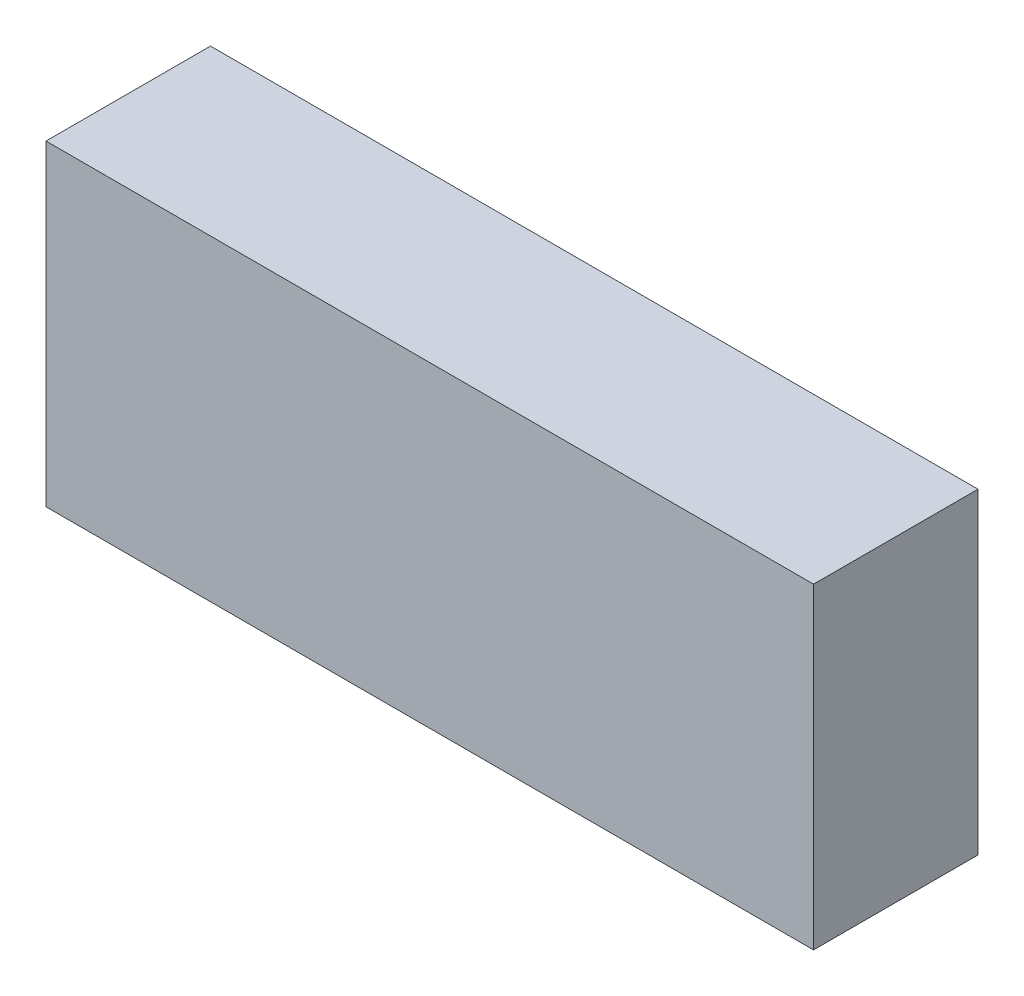
ISO-10303-21;
HEADER;
FILE_DESCRIPTION(('STEP AP214'),'2;1');
FILE_NAME('part.step','',(''),(''),'','','');
FILE_SCHEMA(('AUTOMOTIVE_DESIGN { 1 0 10303 214 1 1 1 1 }'));
ENDSEC;
DATA;
#1=APPLICATION_CONTEXT('core data for automotive mechanical design processes');
#2=APPLICATION_PROTOCOL_DEFINITION('international standard','automotive_design',2000,#1);
#3=PRODUCT_CONTEXT('',#1,'mechanical');
#4=PRODUCT('Part','Part','',(#3));
#5=PRODUCT_RELATED_PRODUCT_CATEGORY('part','',(#4));
#6=PRODUCT_DEFINITION_FORMATION('','',#4);
#7=PRODUCT_DEFINITION_CONTEXT('part definition',#1,'design');
#8=PRODUCT_DEFINITION('design','',#6,#7);
#9=PRODUCT_DEFINITION_SHAPE('','',#8);
#10=(LENGTH_UNIT() NAMED_UNIT(*) SI_UNIT(.MILLI.,.METRE.));
#11=(NAMED_UNIT(*) PLANE_ANGLE_UNIT() SI_UNIT($,.RADIAN.));
#12=(NAMED_UNIT(*) SI_UNIT($,.STERADIAN.) SOLID_ANGLE_UNIT());
#13=UNCERTAINTY_MEASURE_WITH_UNIT(LENGTH_MEASURE(1.E-05),#10,'distance_accuracy_value','');
#14=(GEOMETRIC_REPRESENTATION_CONTEXT(3) GLOBAL_UNCERTAINTY_ASSIGNED_CONTEXT((#13)) GLOBAL_UNIT_ASSIGNED_CONTEXT((#10,
#11,#12)) REPRESENTATION_CONTEXT('',''));
#15=CARTESIAN_POINT('',(0.,0.,0.));
#16=DIRECTION('',(0.,0.,1.));
#17=DIRECTION('',(1.,0.,0.));
#18=AXIS2_PLACEMENT_3D('',#15,#16,#17);
#19=CARTESIAN_POINT('',(1.5,0.,-0.5));
#20=DIRECTION('',(0.,0.,-1.));
#21=DIRECTION('',(0.,-1.,0.));
#22=AXIS2_PLACEMENT_3D('',#19,#20,#21);
#23=PLANE('',#22);
#24=CARTESIAN_POINT('',(1.5,0.,-0.499999999988));
#25=DIRECTION('',(0.,0.,1.));
#26=DIRECTION('',(1.,0.,0.));
#27=AXIS2_PLACEMENT_3D('',#24,#25,#26);
#28=CIRCLE('',#27,0.34999999999);
#29=CARTESIAN_POINT('',(1.84999999999,0.,-0.499999999988));
#30=VERTEX_POINT('',#29);
#31=CARTESIAN_POINT('',(1.15000000001,0.,-0.499999999988));
#32=VERTEX_POINT('',#31);
#33=EDGE_CURVE('E160',#30,#32,#28,.T.);
#34=ORIENTED_EDGE('',*,*,#33,.F.);
#35=CARTESIAN_POINT('',(1.5,0.,-0.499999999988));
#36=DIRECTION('',(0.,0.,1.));
#37=DIRECTION('',(1.,0.,0.));
#38=AXIS2_PLACEMENT_3D('',#35,#36,#37);
#39=CIRCLE('',#38,0.34999999999);
#40=EDGE_CURVE('E11',#32,#30,#39,.T.);
#41=ORIENTED_EDGE('',*,*,#40,.F.);
#42=EDGE_LOOP('',(#34,#41));
#43=FACE_BOUND('',#42,.T.);
#44=ADVANCED_FACE('F17',(#43),#23,.T.);
#45=CARTESIAN_POINT('',(-1.5,0.,-0.5));
#46=DIRECTION('',(0.,0.,-1.));
#47=DIRECTION('',(0.,-1.,0.));
#48=AXIS2_PLACEMENT_3D('',#45,#46,#47);
#49=PLANE('',#48);
#50=CARTESIAN_POINT('',(-1.5,0.,-0.500000000045));
#51=DIRECTION('',(0.,0.,1.));
#52=DIRECTION('',(1.,0.,0.));
#53=AXIS2_PLACEMENT_3D('',#50,#51,#52);
#54=CIRCLE('',#53,0.349999999948);
#55=CARTESIAN_POINT('',(-1.150000000052,0.,-0.500000000045));
#56=VERTEX_POINT('',#55);
#57=CARTESIAN_POINT('',(-1.849999999948,0.,-0.500000000045));
#58=VERTEX_POINT('',#57);
#59=EDGE_CURVE('E136',#56,#58,#54,.T.);
#60=ORIENTED_EDGE('',*,*,#59,.F.);
#61=CARTESIAN_POINT('',(-1.5,0.,-0.500000000045));
#62=DIRECTION('',(0.,0.,1.));
#63=DIRECTION('',(1.,0.,0.));
#64=AXIS2_PLACEMENT_3D('',#61,#62,#63);
#65=CIRCLE('',#64,0.349999999948);
#66=EDGE_CURVE('E28',#58,#56,#65,.T.);
#67=ORIENTED_EDGE('',*,*,#66,.F.);
#68=EDGE_LOOP('',(#60,#67));
#69=FACE_BOUND('',#68,.T.);
#70=ADVANCED_FACE('F19',(#69),#49,.T.);
#71=CARTESIAN_POINT('',(1.5,0.,-0.450000000058));
#72=DIRECTION('',(0.,0.,1.));
#73=DIRECTION('',(1.,0.,0.));
#74=AXIS2_PLACEMENT_3D('',#71,#72,#73);
#75=CONICAL_SURFACE('',#74,0.399999999978,0.785398163966);
#76=DIRECTION('',(-0.707106781588048,0.,0.707106780785048));
#77=VECTOR('',#76,1.);
#78=CARTESIAN_POINT('',(1.100000000022,0.,-0.450000000058));
#79=LINE('',#78,#77);
#80=CARTESIAN_POINT('',(1.099999999965,0.,-0.45));
#81=VERTEX_POINT('',#80);
#82=EDGE_CURVE('E151',#32,#81,#79,.T.);
#83=ORIENTED_EDGE('',*,*,#82,.F.);
#84=ORIENTED_EDGE('',*,*,#40,.T.);
#85=DIRECTION('',(0.707106781588048,0.,0.707106780785048));
#86=VECTOR('',#85,1.);
#87=CARTESIAN_POINT('',(1.899999999978,0.,-0.450000000058));
#88=LINE('',#87,#86);
#89=CARTESIAN_POINT('',(1.900000000035,0.,-0.45));
#90=VERTEX_POINT('',#89);
#91=EDGE_CURVE('E185',#30,#90,#88,.T.);
#92=ORIENTED_EDGE('',*,*,#91,.T.);
#93=CARTESIAN_POINT('',(1.5,0.,-0.45));
#94=DIRECTION('',(0.,0.,1.));
#95=DIRECTION('',(-1.,0.,0.));
#96=AXIS2_PLACEMENT_3D('',#93,#94,#95);
#97=CIRCLE('',#96,0.4);
#98=EDGE_CURVE('E187',#81,#90,#97,.T.);
#99=ORIENTED_EDGE('',*,*,#98,.F.);
#100=EDGE_LOOP('',(#83,#84,#92,#99));
#101=FACE_BOUND('',#100,.T.);
#102=ADVANCED_FACE('F261',(#101),#75,.T.);
#103=CARTESIAN_POINT('',(-1.5,0.,-0.450000000058));
#104=DIRECTION('',(0.,0.,1.));
#105=DIRECTION('',(1.,0.,0.));
#106=AXIS2_PLACEMENT_3D('',#103,#104,#105);
#107=CONICAL_SURFACE('',#106,0.399999999935,0.785398163397);
#108=DIRECTION('',(-0.707106781186548,0.,0.707106781186548));
#109=VECTOR('',#108,1.);
#110=CARTESIAN_POINT('',(-1.899999999935,0.,-0.450000000058));
#111=LINE('',#110,#109);
#112=CARTESIAN_POINT('',(-1.899999999993,0.,-0.45));
#113=VERTEX_POINT('',#112);
#114=EDGE_CURVE('E161',#58,#113,#111,.T.);
#115=ORIENTED_EDGE('',*,*,#114,.F.);
#116=ORIENTED_EDGE('',*,*,#66,.T.);
#117=DIRECTION('',(0.707106781186548,0.,0.707106781186548));
#118=VECTOR('',#117,1.);
#119=CARTESIAN_POINT('',(-1.100000000065,0.,-0.450000000058));
#120=LINE('',#119,#118);
#121=CARTESIAN_POINT('',(-1.100000000007,0.,-0.45));
#122=VERTEX_POINT('',#121);
#123=EDGE_CURVE('E158',#56,#122,#120,.T.);
#124=ORIENTED_EDGE('',*,*,#123,.T.);
#125=CARTESIAN_POINT('',(-1.5,0.,-0.45));
#126=DIRECTION('',(0.,0.,1.));
#127=DIRECTION('',(-1.,0.,0.));
#128=AXIS2_PLACEMENT_3D('',#125,#126,#127);
#129=CIRCLE('',#128,0.4);
#130=EDGE_CURVE('E78',#113,#122,#129,.T.);
#131=ORIENTED_EDGE('',*,*,#130,.F.);
#132=EDGE_LOOP('',(#115,#116,#124,#131));
#133=FACE_BOUND('',#132,.T.);
#134=ADVANCED_FACE('F259',(#133),#107,.T.);
#135=CARTESIAN_POINT('',(1.5,0.,0.));
#136=DIRECTION('',(0.,0.,-1.));
#137=DIRECTION('',(-1.,0.,0.));
#138=AXIS2_PLACEMENT_3D('',#135,#136,#137);
#139=CYLINDRICAL_SURFACE('',#138,0.4);
#140=DIRECTION('',(0.,0.,-1.));
#141=VECTOR('',#140,1.);
#142=CARTESIAN_POINT('',(1.9,0.,0.));
#143=LINE('',#142,#141);
#144=CARTESIAN_POINT('',(1.9,0.,0.));
#145=VERTEX_POINT('',#144);
#146=EDGE_CURVE('E126',#145,#90,#143,.T.);
#147=ORIENTED_EDGE('',*,*,#146,.F.);
#148=CARTESIAN_POINT('',(1.5,0.,0.));
#149=DIRECTION('',(0.,0.,-1.));
#150=DIRECTION('',(-1.,0.,0.));
#151=AXIS2_PLACEMENT_3D('',#148,#149,#150);
#152=CIRCLE('',#151,0.4);
#153=CARTESIAN_POINT('',(1.1,0.,0.));
#154=VERTEX_POINT('',#153);
#155=EDGE_CURVE('E114',#145,#154,#152,.T.);
#156=ORIENTED_EDGE('',*,*,#155,.T.);
#157=DIRECTION('',(0.,0.,-1.));
#158=VECTOR('',#157,1.);
#159=CARTESIAN_POINT('',(1.1,0.,0.));
#160=LINE('',#159,#158);
#161=EDGE_CURVE('E123',#154,#81,#160,.T.);
#162=ORIENTED_EDGE('',*,*,#161,.T.);
#163=ORIENTED_EDGE('',*,*,#98,.T.);
#164=EDGE_LOOP('',(#147,#156,#162,#163));
#165=FACE_BOUND('',#164,.T.);
#166=ADVANCED_FACE('F122',(#165),#139,.T.);
#167=CARTESIAN_POINT('',(-1.5,0.,0.));
#168=DIRECTION('',(0.,0.,-1.));
#169=DIRECTION('',(-1.,0.,0.));
#170=AXIS2_PLACEMENT_3D('',#167,#168,#169);
#171=CYLINDRICAL_SURFACE('',#170,0.4);
#172=DIRECTION('',(0.,0.,-1.));
#173=VECTOR('',#172,1.);
#174=CARTESIAN_POINT('',(-1.1,0.,0.));
#175=LINE('',#174,#173);
#176=CARTESIAN_POINT('',(-1.1,0.,0.));
#177=VERTEX_POINT('',#176);
#178=EDGE_CURVE('E223',#177,#122,#175,.T.);
#179=ORIENTED_EDGE('',*,*,#178,.F.);
#180=CARTESIAN_POINT('',(-1.5,0.,0.));
#181=DIRECTION('',(0.,0.,-1.));
#182=DIRECTION('',(-1.,0.,0.));
#183=AXIS2_PLACEMENT_3D('',#180,#181,#182);
#184=CIRCLE('',#183,0.4);
#185=CARTESIAN_POINT('',(-1.9,0.,0.));
#186=VERTEX_POINT('',#185);
#187=EDGE_CURVE('E90',#177,#186,#184,.T.);
#188=ORIENTED_EDGE('',*,*,#187,.T.);
#189=DIRECTION('',(0.,0.,-1.));
#190=VECTOR('',#189,1.);
#191=CARTESIAN_POINT('',(-1.9,0.,0.));
#192=LINE('',#191,#190);
#193=EDGE_CURVE('E140',#186,#113,#192,.T.);
#194=ORIENTED_EDGE('',*,*,#193,.T.);
#195=ORIENTED_EDGE('',*,*,#130,.T.);
#196=EDGE_LOOP('',(#179,#188,#194,#195));
#197=FACE_BOUND('',#196,.T.);
#198=ADVANCED_FACE('F268',(#197),#171,.T.);
#199=CARTESIAN_POINT('',(0.,0.,0.));
#200=DIRECTION('',(0.,0.,1.));
#201=DIRECTION('',(1.,0.,0.));
#202=AXIS2_PLACEMENT_3D('',#199,#200,#201);
#203=PLANE('',#202);
#204=DIRECTION('',(-1.,0.,0.));
#205=VECTOR('',#204,1.);
#206=CARTESIAN_POINT('',(0.,1.3,0.));
#207=LINE('',#206,#205);
#208=CARTESIAN_POINT('',(3.15,1.3,0.));
#209=VERTEX_POINT('',#208);
#210=CARTESIAN_POINT('',(-3.15,1.3,0.));
#211=VERTEX_POINT('',#210);
#212=EDGE_CURVE('E42',#209,#211,#207,.T.);
#213=ORIENTED_EDGE('',*,*,#212,.F.);
#214=DIRECTION('',(0.,1.,0.));
#215=VECTOR('',#214,1.);
#216=CARTESIAN_POINT('',(3.15,0.,0.));
#217=LINE('',#216,#215);
#218=CARTESIAN_POINT('',(3.15,-1.3,0.));
#219=VERTEX_POINT('',#218);
#220=EDGE_CURVE('E201',#219,#209,#217,.T.);
#221=ORIENTED_EDGE('',*,*,#220,.F.);
#222=DIRECTION('',(1.,0.,0.));
#223=VECTOR('',#222,1.);
#224=CARTESIAN_POINT('',(0.,-1.3,0.));
#225=LINE('',#224,#223);
#226=CARTESIAN_POINT('',(-3.15,-1.3,0.));
#227=VERTEX_POINT('',#226);
#228=EDGE_CURVE('E211',#227,#219,#225,.T.);
#229=ORIENTED_EDGE('',*,*,#228,.F.);
#230=DIRECTION('',(0.,-1.,0.));
#231=VECTOR('',#230,1.);
#232=CARTESIAN_POINT('',(-3.15,0.,0.));
#233=LINE('',#232,#231);
#234=EDGE_CURVE('E218',#211,#227,#233,.T.);
#235=ORIENTED_EDGE('',*,*,#234,.F.);
#236=EDGE_LOOP('',(#213,#221,#229,#235));
#237=FACE_BOUND('',#236,.T.);
#238=CARTESIAN_POINT('',(1.5,0.,0.));
#239=DIRECTION('',(0.,0.,-1.));
#240=DIRECTION('',(-1.,0.,0.));
#241=AXIS2_PLACEMENT_3D('',#238,#239,#240);
#242=CIRCLE('',#241,0.4);
#243=EDGE_CURVE('E132',#154,#145,#242,.T.);
#244=ORIENTED_EDGE('',*,*,#243,.F.);
#245=ORIENTED_EDGE('',*,*,#155,.F.);
#246=EDGE_LOOP('',(#244,#245));
#247=FACE_BOUND('',#246,.T.);
#248=CARTESIAN_POINT('',(-1.5,0.,0.));
#249=DIRECTION('',(0.,0.,-1.));
#250=DIRECTION('',(-1.,0.,0.));
#251=AXIS2_PLACEMENT_3D('',#248,#249,#250);
#252=CIRCLE('',#251,0.4);
#253=EDGE_CURVE('E219',#186,#177,#252,.T.);
#254=ORIENTED_EDGE('',*,*,#253,.F.);
#255=ORIENTED_EDGE('',*,*,#187,.F.);
#256=EDGE_LOOP('',(#254,#255));
#257=FACE_BOUND('',#256,.T.);
#258=ADVANCED_FACE('F138',(#237,#247,#257),#203,.F.);
#259=CARTESIAN_POINT('',(0.,1.3,0.));
#260=DIRECTION('',(0.,1.,0.));
#261=DIRECTION('',(1.,0.,0.));
#262=AXIS2_PLACEMENT_3D('',#259,#260,#261);
#263=PLANE('',#262);
#264=ORIENTED_EDGE('',*,*,#212,.T.);
#265=DIRECTION('',(0.,0.,-1.));
#266=VECTOR('',#265,1.);
#267=CARTESIAN_POINT('',(-3.15,1.3,0.));
#268=LINE('',#267,#266);
#269=CARTESIAN_POINT('',(-3.15,1.3,1.35));
#270=VERTEX_POINT('',#269);
#271=EDGE_CURVE('E224',#270,#211,#268,.T.);
#272=ORIENTED_EDGE('',*,*,#271,.F.);
#273=DIRECTION('',(-1.,0.,0.));
#274=VECTOR('',#273,1.);
#275=CARTESIAN_POINT('',(0.,1.3,1.35));
#276=LINE('',#275,#274);
#277=CARTESIAN_POINT('',(3.15,1.3,1.35));
#278=VERTEX_POINT('',#277);
#279=EDGE_CURVE('E21',#278,#270,#276,.T.);
#280=ORIENTED_EDGE('',*,*,#279,.F.);
#281=DIRECTION('',(0.,0.,1.));
#282=VECTOR('',#281,1.);
#283=CARTESIAN_POINT('',(3.15,1.3,0.));
#284=LINE('',#283,#282);
#285=EDGE_CURVE('E205',#209,#278,#284,.T.);
#286=ORIENTED_EDGE('',*,*,#285,.F.);
#287=EDGE_LOOP('',(#264,#272,#280,#286));
#288=FACE_BOUND('',#287,.T.);
#289=ADVANCED_FACE('F289',(#288),#263,.T.);
#290=CARTESIAN_POINT('',(-3.15,0.,0.));
#291=DIRECTION('',(-1.,0.,0.));
#292=DIRECTION('',(0.,0.,1.));
#293=AXIS2_PLACEMENT_3D('',#290,#291,#292);
#294=PLANE('',#293);
#295=ORIENTED_EDGE('',*,*,#234,.T.);
#296=DIRECTION('',(0.,0.,-1.));
#297=VECTOR('',#296,1.);
#298=CARTESIAN_POINT('',(-3.15,-1.3,0.));
#299=LINE('',#298,#297);
#300=CARTESIAN_POINT('',(-3.15,-1.3,1.35));
#301=VERTEX_POINT('',#300);
#302=EDGE_CURVE('E213',#301,#227,#299,.T.);
#303=ORIENTED_EDGE('',*,*,#302,.F.);
#304=DIRECTION('',(0.,-1.,0.));
#305=VECTOR('',#304,1.);
#306=CARTESIAN_POINT('',(-3.15,0.,1.35));
#307=LINE('',#306,#305);
#308=EDGE_CURVE('E206',#270,#301,#307,.T.);
#309=ORIENTED_EDGE('',*,*,#308,.F.);
#310=ORIENTED_EDGE('',*,*,#271,.T.);
#311=EDGE_LOOP('',(#295,#303,#309,#310));
#312=FACE_BOUND('',#311,.T.);
#313=ADVANCED_FACE('F292',(#312),#294,.T.);
#314=CARTESIAN_POINT('',(0.,-1.3,0.));
#315=DIRECTION('',(0.,-1.,0.));
#316=DIRECTION('',(0.,0.,-1.));
#317=AXIS2_PLACEMENT_3D('',#314,#315,#316);
#318=PLANE('',#317);
#319=ORIENTED_EDGE('',*,*,#228,.T.);
#320=DIRECTION('',(0.,0.,-1.));
#321=VECTOR('',#320,1.);
#322=CARTESIAN_POINT('',(3.15,-1.3,0.));
#323=LINE('',#322,#321);
#324=CARTESIAN_POINT('',(3.15,-1.3,1.35));
#325=VERTEX_POINT('',#324);
#326=EDGE_CURVE('E207',#325,#219,#323,.T.);
#327=ORIENTED_EDGE('',*,*,#326,.F.);
#328=DIRECTION('',(1.,0.,0.));
#329=VECTOR('',#328,1.);
#330=CARTESIAN_POINT('',(0.,-1.3,1.35));
#331=LINE('',#330,#329);
#332=EDGE_CURVE('E157',#301,#325,#331,.T.);
#333=ORIENTED_EDGE('',*,*,#332,.F.);
#334=ORIENTED_EDGE('',*,*,#302,.T.);
#335=EDGE_LOOP('',(#319,#327,#333,#334));
#336=FACE_BOUND('',#335,.T.);
#337=ADVANCED_FACE('F285',(#336),#318,.T.);
#338=CARTESIAN_POINT('',(3.15,0.,0.));
#339=DIRECTION('',(1.,0.,0.));
#340=DIRECTION('',(0.,1.,0.));
#341=AXIS2_PLACEMENT_3D('',#338,#339,#340);
#342=PLANE('',#341);
#343=ORIENTED_EDGE('',*,*,#220,.T.);
#344=ORIENTED_EDGE('',*,*,#285,.T.);
#345=DIRECTION('',(0.,1.,0.));
#346=VECTOR('',#345,1.);
#347=CARTESIAN_POINT('',(3.15,0.,1.35));
#348=LINE('',#347,#346);
#349=EDGE_CURVE('E153',#325,#278,#348,.T.);
#350=ORIENTED_EDGE('',*,*,#349,.F.);
#351=ORIENTED_EDGE('',*,*,#326,.T.);
#352=EDGE_LOOP('',(#343,#344,#350,#351));
#353=FACE_BOUND('',#352,.T.);
#354=ADVANCED_FACE('F281',(#353),#342,.T.);
#355=CARTESIAN_POINT('',(0.,0.,1.35));
#356=DIRECTION('',(0.,0.,1.));
#357=DIRECTION('',(1.,0.,0.));
#358=AXIS2_PLACEMENT_3D('',#355,#356,#357);
#359=PLANE('',#358);
#360=ORIENTED_EDGE('',*,*,#332,.T.);
#361=ORIENTED_EDGE('',*,*,#349,.T.);
#362=ORIENTED_EDGE('',*,*,#279,.T.);
#363=ORIENTED_EDGE('',*,*,#308,.T.);
#364=EDGE_LOOP('',(#360,#361,#362,#363));
#365=FACE_BOUND('',#364,.T.);
#366=ADVANCED_FACE('F284',(#365),#359,.T.);
#367=CARTESIAN_POINT('',(1.5,0.,-0.450000000058));
#368=DIRECTION('',(0.,0.,1.));
#369=DIRECTION('',(1.,0.,0.));
#370=AXIS2_PLACEMENT_3D('',#367,#368,#369);
#371=CONICAL_SURFACE('',#370,0.399999999978,0.785398163966);
#372=ORIENTED_EDGE('',*,*,#33,.T.);
#373=ORIENTED_EDGE('',*,*,#82,.T.);
#374=CARTESIAN_POINT('',(1.5,0.,-0.45));
#375=DIRECTION('',(0.,0.,1.));
#376=DIRECTION('',(-1.,0.,0.));
#377=AXIS2_PLACEMENT_3D('',#374,#375,#376);
#378=CIRCLE('',#377,0.4);
#379=EDGE_CURVE('E134',#90,#81,#378,.T.);
#380=ORIENTED_EDGE('',*,*,#379,.F.);
#381=ORIENTED_EDGE('',*,*,#91,.F.);
#382=EDGE_LOOP('',(#372,#373,#380,#381));
#383=FACE_BOUND('',#382,.T.);
#384=ADVANCED_FACE('F299',(#383),#371,.T.);
#385=CARTESIAN_POINT('',(-1.5,0.,-0.450000000058));
#386=DIRECTION('',(0.,0.,1.));
#387=DIRECTION('',(1.,0.,0.));
#388=AXIS2_PLACEMENT_3D('',#385,#386,#387);
#389=CONICAL_SURFACE('',#388,0.399999999935,0.785398163397);
#390=ORIENTED_EDGE('',*,*,#59,.T.);
#391=ORIENTED_EDGE('',*,*,#114,.T.);
#392=CARTESIAN_POINT('',(-1.5,0.,-0.45));
#393=DIRECTION('',(0.,0.,1.));
#394=DIRECTION('',(-1.,0.,0.));
#395=AXIS2_PLACEMENT_3D('',#392,#393,#394);
#396=CIRCLE('',#395,0.4);
#397=EDGE_CURVE('E147',#122,#113,#396,.T.);
#398=ORIENTED_EDGE('',*,*,#397,.F.);
#399=ORIENTED_EDGE('',*,*,#123,.F.);
#400=EDGE_LOOP('',(#390,#391,#398,#399));
#401=FACE_BOUND('',#400,.T.);
#402=ADVANCED_FACE('F254',(#401),#389,.T.);
#403=CARTESIAN_POINT('',(1.5,0.,0.));
#404=DIRECTION('',(0.,0.,-1.));
#405=DIRECTION('',(-1.,0.,0.));
#406=AXIS2_PLACEMENT_3D('',#403,#404,#405);
#407=CYLINDRICAL_SURFACE('',#406,0.4);
#408=ORIENTED_EDGE('',*,*,#243,.T.);
#409=ORIENTED_EDGE('',*,*,#146,.T.);
#410=ORIENTED_EDGE('',*,*,#379,.T.);
#411=ORIENTED_EDGE('',*,*,#161,.F.);
#412=EDGE_LOOP('',(#408,#409,#410,#411));
#413=FACE_BOUND('',#412,.T.);
#414=ADVANCED_FACE('F131',(#413),#407,.T.);
#415=CARTESIAN_POINT('',(-1.5,0.,0.));
#416=DIRECTION('',(0.,0.,-1.));
#417=DIRECTION('',(-1.,0.,0.));
#418=AXIS2_PLACEMENT_3D('',#415,#416,#417);
#419=CYLINDRICAL_SURFACE('',#418,0.4);
#420=ORIENTED_EDGE('',*,*,#253,.T.);
#421=ORIENTED_EDGE('',*,*,#178,.T.);
#422=ORIENTED_EDGE('',*,*,#397,.T.);
#423=ORIENTED_EDGE('',*,*,#193,.F.);
#424=EDGE_LOOP('',(#420,#421,#422,#423));
#425=FACE_BOUND('',#424,.T.);
#426=ADVANCED_FACE('F253',(#425),#419,.T.);
#427=CLOSED_SHELL('',(#44,#70,#102,#134,#166,#198,#258,#289,#313,#337,#354,#366,#384,#402,#414,#426));
#428=MANIFOLD_SOLID_BREP('B1',#427);
#429=ADVANCED_BREP_SHAPE_REPRESENTATION('',(#18,#428),#14);
#430=SHAPE_DEFINITION_REPRESENTATION(#9,#429);
ENDSEC;
END-ISO-10303-21;
